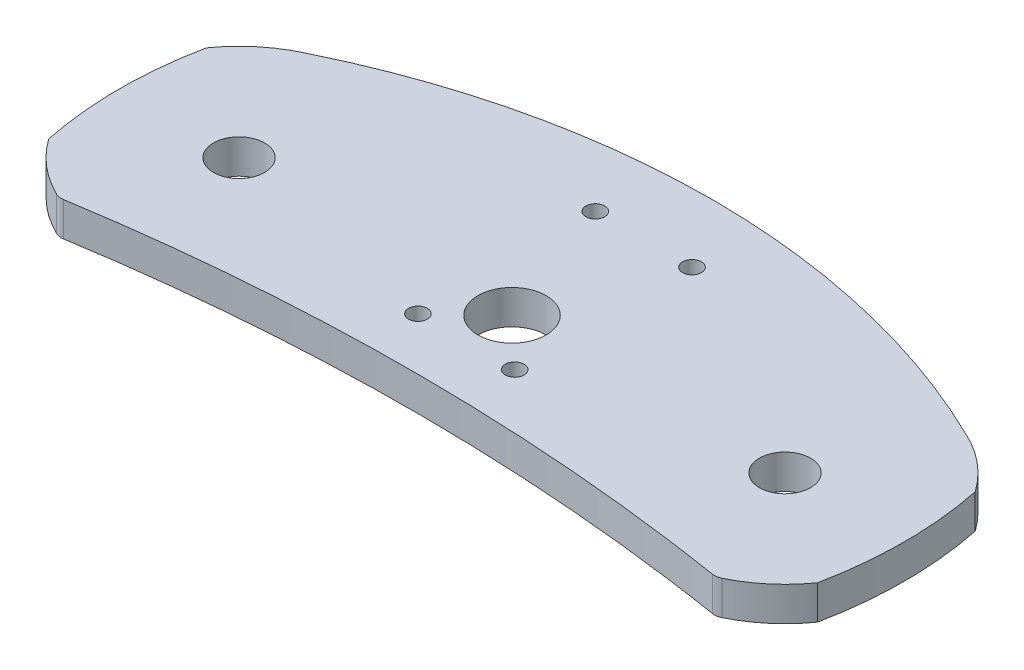
ISO-10303-21;
HEADER;
FILE_DESCRIPTION(('STEP AP214'),'2;1');
FILE_NAME('part.step','',(''),(''),'','','');
FILE_SCHEMA(('AUTOMOTIVE_DESIGN { 1 0 10303 214 1 1 1 1 }'));
ENDSEC;
DATA;
#1=APPLICATION_CONTEXT('core data for automotive mechanical design processes');
#2=APPLICATION_PROTOCOL_DEFINITION('international standard','automotive_design',2000,#1);
#3=PRODUCT_CONTEXT('',#1,'mechanical');
#4=PRODUCT('Part','Part','',(#3));
#5=PRODUCT_RELATED_PRODUCT_CATEGORY('part','',(#4));
#6=PRODUCT_DEFINITION_FORMATION('','',#4);
#7=PRODUCT_DEFINITION_CONTEXT('part definition',#1,'design');
#8=PRODUCT_DEFINITION('design','',#6,#7);
#9=PRODUCT_DEFINITION_SHAPE('','',#8);
#10=(LENGTH_UNIT() NAMED_UNIT(*) SI_UNIT(.MILLI.,.METRE.));
#11=(NAMED_UNIT(*) PLANE_ANGLE_UNIT() SI_UNIT($,.RADIAN.));
#12=(NAMED_UNIT(*) SI_UNIT($,.STERADIAN.) SOLID_ANGLE_UNIT());
#13=UNCERTAINTY_MEASURE_WITH_UNIT(LENGTH_MEASURE(1.E-05),#10,'distance_accuracy_value','');
#14=(GEOMETRIC_REPRESENTATION_CONTEXT(3) GLOBAL_UNCERTAINTY_ASSIGNED_CONTEXT((#13)) GLOBAL_UNIT_ASSIGNED_CONTEXT((#10,
#11,#12)) REPRESENTATION_CONTEXT('',''));
#15=CARTESIAN_POINT('',(0.,0.,0.));
#16=DIRECTION('',(0.,0.,1.));
#17=DIRECTION('',(1.,0.,0.));
#18=AXIS2_PLACEMENT_3D('',#15,#16,#17);
#19=CARTESIAN_POINT('',(0.,6.35,0.));
#20=DIRECTION('',(0.,1.,0.));
#21=DIRECTION('',(0.,0.,1.));
#22=AXIS2_PLACEMENT_3D('',#19,#20,#21);
#23=PLANE('',#22);
#24=CARTESIAN_POINT('',(9.,6.35,8.50000000000001));
#25=DIRECTION('',(0.,1.,0.));
#26=DIRECTION('',(0.,0.,1.));
#27=AXIS2_PLACEMENT_3D('',#24,#25,#26);
#28=CIRCLE('',#27,1.75);
#29=CARTESIAN_POINT('',(9.,6.35,10.25));
#30=VERTEX_POINT('',#29);
#31=EDGE_CURVE('E155',#30,#30,#28,.T.);
#32=ORIENTED_EDGE('',*,*,#31,.F.);
#33=EDGE_LOOP('',(#32));
#34=FACE_BOUND('',#33,.T.);
#35=CARTESIAN_POINT('',(9.,6.35,-24.5));
#36=DIRECTION('',(0.,1.,0.));
#37=DIRECTION('',(0.,0.,1.));
#38=AXIS2_PLACEMENT_3D('',#35,#36,#37);
#39=CIRCLE('',#38,1.75);
#40=CARTESIAN_POINT('',(9.,6.35,-22.75));
#41=VERTEX_POINT('',#40);
#42=EDGE_CURVE('E349',#41,#41,#39,.T.);
#43=ORIENTED_EDGE('',*,*,#42,.F.);
#44=EDGE_LOOP('',(#43));
#45=FACE_BOUND('',#44,.T.);
#46=CARTESIAN_POINT('',(-9.,6.35,-24.5));
#47=DIRECTION('',(0.,1.,0.));
#48=DIRECTION('',(0.,0.,1.));
#49=AXIS2_PLACEMENT_3D('',#46,#47,#48);
#50=CIRCLE('',#49,1.75);
#51=CARTESIAN_POINT('',(-9.,6.35,-22.75));
#52=VERTEX_POINT('',#51);
#53=EDGE_CURVE('E346',#52,#52,#50,.T.);
#54=ORIENTED_EDGE('',*,*,#53,.F.);
#55=EDGE_LOOP('',(#54));
#56=FACE_BOUND('',#55,.T.);
#57=CARTESIAN_POINT('',(-9.,6.35,8.50000000000001));
#58=DIRECTION('',(0.,1.,0.));
#59=DIRECTION('',(0.,0.,1.));
#60=AXIS2_PLACEMENT_3D('',#57,#58,#59);
#61=CIRCLE('',#60,1.75);
#62=CARTESIAN_POINT('',(-9.,6.35,10.25));
#63=VERTEX_POINT('',#62);
#64=EDGE_CURVE('E342',#63,#63,#61,.T.);
#65=ORIENTED_EDGE('',*,*,#64,.F.);
#66=EDGE_LOOP('',(#65));
#67=FACE_BOUND('',#66,.T.);
#68=CARTESIAN_POINT('',(0.,6.35,0.));
#69=DIRECTION('',(0.,1.,0.));
#70=DIRECTION('',(0.,0.,1.));
#71=AXIS2_PLACEMENT_3D('',#68,#69,#70);
#72=CIRCLE('',#71,6.35);
#73=CARTESIAN_POINT('',(0.,6.35,6.35000000000001));
#74=VERTEX_POINT('',#73);
#75=EDGE_CURVE('E187',#74,#74,#72,.T.);
#76=ORIENTED_EDGE('',*,*,#75,.F.);
#77=EDGE_LOOP('',(#76));
#78=FACE_BOUND('',#77,.T.);
#79=CARTESIAN_POINT('',(-50.8,6.35,0.));
#80=DIRECTION('',(0.,1.,0.));
#81=DIRECTION('',(0.,0.,1.));
#82=AXIS2_PLACEMENT_3D('',#79,#80,#81);
#83=CIRCLE('',#82,4.7625);
#84=CARTESIAN_POINT('',(-50.8,6.35,4.7625));
#85=VERTEX_POINT('',#84);
#86=EDGE_CURVE('E178',#85,#85,#83,.T.);
#87=ORIENTED_EDGE('',*,*,#86,.F.);
#88=EDGE_LOOP('',(#87));
#89=FACE_BOUND('',#88,.T.);
#90=CARTESIAN_POINT('',(50.8,6.35,0.));
#91=DIRECTION('',(0.,1.,0.));
#92=DIRECTION('',(0.,0.,1.));
#93=AXIS2_PLACEMENT_3D('',#90,#91,#92);
#94=CIRCLE('',#93,4.7625);
#95=CARTESIAN_POINT('',(50.8,6.35,4.7625));
#96=VERTEX_POINT('',#95);
#97=EDGE_CURVE('E179',#96,#96,#94,.F.);
#98=ORIENTED_EDGE('',*,*,#97,.T.);
#99=EDGE_LOOP('',(#98));
#100=FACE_BOUND('',#99,.T.);
#101=CARTESIAN_POINT('',(-61.1507706135107,6.35,23.1952914986314));
#102=CARTESIAN_POINT('',(2.26673799087616E-13,6.35,13.2848358772638));
#103=CARTESIAN_POINT('',(61.1507706135112,6.35,23.1952914986312));
#104=B_SPLINE_CURVE_WITH_KNOTS('',2,(#101,#102,#103),.UNSPECIFIED.,.F.,.F.,(3,3),(0.,1.),.UNSPECIFIED.);
#105=CARTESIAN_POINT('',(-60.3842002333651,6.35,23.0718352568143));
#106=VERTEX_POINT('',#105);
#107=CARTESIAN_POINT('',(60.3842002333655,6.35,23.0718352568141));
#108=VERTEX_POINT('',#107);
#109=EDGE_CURVE('E257',#106,#108,#104,.T.);
#110=ORIENTED_EDGE('',*,*,#109,.T.);
#111=CARTESIAN_POINT('',(60.7855799828204,6.35,20.5637494734471));
#112=DIRECTION('',(0.,1.,0.));
#113=DIRECTION('',(0.,0.,1.));
#114=AXIS2_PLACEMENT_3D('',#111,#112,#113);
#115=CIRCLE('',#114,2.54);
#116=CARTESIAN_POINT('',(61.8950888698005,6.35,22.8486105260523));
#117=VERTEX_POINT('',#116);
#118=EDGE_CURVE('E237',#108,#117,#115,.T.);
#119=ORIENTED_EDGE('',*,*,#118,.T.);
#120=CARTESIAN_POINT('',(50.8,6.35,0.));
#121=DIRECTION('',(0.,1.,0.));
#122=DIRECTION('',(0.,0.,1.));
#123=AXIS2_PLACEMENT_3D('',#120,#121,#122);
#124=CIRCLE('',#123,25.4);
#125=CARTESIAN_POINT('',(71.53671875,6.35,14.6679410785359));
#126=VERTEX_POINT('',#125);
#127=EDGE_CURVE('E195',#117,#126,#124,.T.);
#128=ORIENTED_EDGE('',*,*,#127,.T.);
#129=CARTESIAN_POINT('',(0.,6.35,0.));
#130=DIRECTION('',(0.,1.,0.));
#131=DIRECTION('',(0.,0.,1.));
#132=AXIS2_PLACEMENT_3D('',#129,#130,#131);
#133=CIRCLE('',#132,73.025);
#134=CARTESIAN_POINT('',(71.53671875,6.35,-14.6679410785359));
#135=VERTEX_POINT('',#134);
#136=EDGE_CURVE('E218',#126,#135,#133,.T.);
#137=ORIENTED_EDGE('',*,*,#136,.T.);
#138=CARTESIAN_POINT('',(50.8,6.35,0.));
#139=DIRECTION('',(0.,1.,0.));
#140=DIRECTION('',(0.,0.,1.));
#141=AXIS2_PLACEMENT_3D('',#138,#139,#140);
#142=CIRCLE('',#141,25.4);
#143=CARTESIAN_POINT('',(61.1507706135103,6.35,-23.1952914986316));
#144=VERTEX_POINT('',#143);
#145=EDGE_CURVE('E148',#135,#144,#142,.T.);
#146=ORIENTED_EDGE('',*,*,#145,.T.);
#147=CARTESIAN_POINT('',(0.,6.35,102.409936312052));
#148=DIRECTION('',(0.,1.,0.));
#149=DIRECTION('',(0.,0.,1.));
#150=AXIS2_PLACEMENT_3D('',#147,#148,#149);
#151=CIRCLE('',#150,139.7);
#152=CARTESIAN_POINT('',(-61.1507706135103,6.35,-23.1952914986316));
#153=VERTEX_POINT('',#152);
#154=EDGE_CURVE('E152',#153,#144,#151,.F.);
#155=ORIENTED_EDGE('',*,*,#154,.F.);
#156=CARTESIAN_POINT('',(-50.8,6.35,0.));
#157=DIRECTION('',(0.,1.,0.));
#158=DIRECTION('',(0.,0.,1.));
#159=AXIS2_PLACEMENT_3D('',#156,#157,#158);
#160=CIRCLE('',#159,25.4);
#161=CARTESIAN_POINT('',(-71.53671875,6.35,-14.6679410785359));
#162=VERTEX_POINT('',#161);
#163=EDGE_CURVE('E128',#153,#162,#160,.T.);
#164=ORIENTED_EDGE('',*,*,#163,.T.);
#165=CARTESIAN_POINT('',(-71.53671875,6.35,14.6679410785359));
#166=VERTEX_POINT('',#165);
#167=EDGE_CURVE('E223',#162,#166,#133,.T.);
#168=ORIENTED_EDGE('',*,*,#167,.T.);
#169=CARTESIAN_POINT('',(-50.8,6.35,0.));
#170=DIRECTION('',(0.,1.,0.));
#171=DIRECTION('',(0.,0.,1.));
#172=AXIS2_PLACEMENT_3D('',#169,#170,#171);
#173=CIRCLE('',#172,25.4);
#174=CARTESIAN_POINT('',(-61.8950888698,6.35,22.8486105260526));
#175=VERTEX_POINT('',#174);
#176=EDGE_CURVE('E199',#166,#175,#173,.T.);
#177=ORIENTED_EDGE('',*,*,#176,.T.);
#178=CARTESIAN_POINT('',(-60.78557998282,6.35,20.5637494734473));
#179=DIRECTION('',(0.,1.,0.));
#180=DIRECTION('',(0.,0.,1.));
#181=AXIS2_PLACEMENT_3D('',#178,#179,#180);
#182=CIRCLE('',#181,2.54);
#183=EDGE_CURVE('E234',#175,#106,#182,.T.);
#184=ORIENTED_EDGE('',*,*,#183,.T.);
#185=EDGE_LOOP('',(#110,#119,#128,#137,#146,#155,#164,#168,#177,#184));
#186=FACE_BOUND('',#185,.T.);
#187=ADVANCED_FACE('F41',(#34,#45,#56,#67,#78,#89,#100,#186),#23,.T.);
#188=CARTESIAN_POINT('',(0.,0.,0.));
#189=DIRECTION('',(0.,1.,0.));
#190=DIRECTION('',(0.,0.,1.));
#191=AXIS2_PLACEMENT_3D('',#188,#189,#190);
#192=PLANE('',#191);
#193=CARTESIAN_POINT('',(0.,0.,0.));
#194=DIRECTION('',(0.,1.,0.));
#195=DIRECTION('',(0.,0.,1.));
#196=AXIS2_PLACEMENT_3D('',#193,#194,#195);
#197=CIRCLE('',#196,6.35);
#198=CARTESIAN_POINT('',(0.,0.,6.35000000000001));
#199=VERTEX_POINT('',#198);
#200=EDGE_CURVE('E183',#199,#199,#197,.T.);
#201=ORIENTED_EDGE('',*,*,#200,.T.);
#202=EDGE_LOOP('',(#201));
#203=FACE_BOUND('',#202,.T.);
#204=CARTESIAN_POINT('',(-50.8,0.,0.));
#205=DIRECTION('',(0.,1.,0.));
#206=DIRECTION('',(0.,0.,1.));
#207=AXIS2_PLACEMENT_3D('',#204,#205,#206);
#208=CIRCLE('',#207,4.7625);
#209=CARTESIAN_POINT('',(-50.8,0.,4.7625));
#210=VERTEX_POINT('',#209);
#211=EDGE_CURVE('E203',#210,#210,#208,.T.);
#212=ORIENTED_EDGE('',*,*,#211,.T.);
#213=EDGE_LOOP('',(#212));
#214=FACE_BOUND('',#213,.T.);
#215=CARTESIAN_POINT('',(50.8,0.,0.));
#216=DIRECTION('',(0.,1.,0.));
#217=DIRECTION('',(0.,0.,1.));
#218=AXIS2_PLACEMENT_3D('',#215,#216,#217);
#219=CIRCLE('',#218,4.7625);
#220=CARTESIAN_POINT('',(50.8,0.,4.7625));
#221=VERTEX_POINT('',#220);
#222=EDGE_CURVE('E174',#221,#221,#219,.F.);
#223=ORIENTED_EDGE('',*,*,#222,.F.);
#224=EDGE_LOOP('',(#223));
#225=FACE_BOUND('',#224,.T.);
#226=CARTESIAN_POINT('',(-9.,0.,8.50000000000001));
#227=DIRECTION('',(0.,-1.,0.));
#228=DIRECTION('',(0.,0.,-1.));
#229=AXIS2_PLACEMENT_3D('',#226,#227,#228);
#230=CIRCLE('',#229,1.75);
#231=CARTESIAN_POINT('',(-9.,0.,6.75000000000001));
#232=VERTEX_POINT('',#231);
#233=EDGE_CURVE('E331',#232,#232,#230,.T.);
#234=ORIENTED_EDGE('',*,*,#233,.F.);
#235=EDGE_LOOP('',(#234));
#236=FACE_BOUND('',#235,.T.);
#237=CARTESIAN_POINT('',(-9.,0.,-24.5));
#238=DIRECTION('',(0.,-1.,0.));
#239=DIRECTION('',(0.,0.,-1.));
#240=AXIS2_PLACEMENT_3D('',#237,#238,#239);
#241=CIRCLE('',#240,1.75);
#242=CARTESIAN_POINT('',(-9.,0.,-26.25));
#243=VERTEX_POINT('',#242);
#244=EDGE_CURVE('E324',#243,#243,#241,.T.);
#245=ORIENTED_EDGE('',*,*,#244,.F.);
#246=EDGE_LOOP('',(#245));
#247=FACE_BOUND('',#246,.T.);
#248=CARTESIAN_POINT('',(9.,0.,-24.5));
#249=DIRECTION('',(0.,-1.,0.));
#250=DIRECTION('',(0.,0.,-1.));
#251=AXIS2_PLACEMENT_3D('',#248,#249,#250);
#252=CIRCLE('',#251,1.75);
#253=CARTESIAN_POINT('',(9.,0.,-26.25));
#254=VERTEX_POINT('',#253);
#255=EDGE_CURVE('E332',#254,#254,#252,.T.);
#256=ORIENTED_EDGE('',*,*,#255,.F.);
#257=EDGE_LOOP('',(#256));
#258=FACE_BOUND('',#257,.T.);
#259=CARTESIAN_POINT('',(9.,0.,8.50000000000001));
#260=DIRECTION('',(0.,-1.,0.));
#261=DIRECTION('',(0.,0.,-1.));
#262=AXIS2_PLACEMENT_3D('',#259,#260,#261);
#263=CIRCLE('',#262,1.75);
#264=CARTESIAN_POINT('',(9.,0.,6.75000000000001));
#265=VERTEX_POINT('',#264);
#266=EDGE_CURVE('E256',#265,#265,#263,.T.);
#267=ORIENTED_EDGE('',*,*,#266,.F.);
#268=EDGE_LOOP('',(#267));
#269=FACE_BOUND('',#268,.T.);
#270=CARTESIAN_POINT('',(50.8,0.,0.));
#271=DIRECTION('',(0.,1.,0.));
#272=DIRECTION('',(0.,0.,1.));
#273=AXIS2_PLACEMENT_3D('',#270,#271,#272);
#274=CIRCLE('',#273,25.4);
#275=CARTESIAN_POINT('',(61.8950888698005,0.,22.8486105260523));
#276=VERTEX_POINT('',#275);
#277=CARTESIAN_POINT('',(71.53671875,0.,14.6679410785359));
#278=VERTEX_POINT('',#277);
#279=EDGE_CURVE('E194',#276,#278,#274,.T.);
#280=ORIENTED_EDGE('',*,*,#279,.F.);
#281=CARTESIAN_POINT('',(60.7855799828204,0.,20.5637494734471));
#282=DIRECTION('',(0.,1.,0.));
#283=DIRECTION('',(0.,0.,1.));
#284=AXIS2_PLACEMENT_3D('',#281,#282,#283);
#285=CIRCLE('',#284,2.54);
#286=CARTESIAN_POINT('',(60.3842002333655,0.,23.0718352568141));
#287=VERTEX_POINT('',#286);
#288=EDGE_CURVE('E50',#276,#287,#285,.F.);
#289=ORIENTED_EDGE('',*,*,#288,.T.);
#290=CARTESIAN_POINT('',(-61.1507706135107,0.,23.1952914986314));
#291=CARTESIAN_POINT('',(2.26673799087616E-13,0.,13.2848358772638));
#292=CARTESIAN_POINT('',(61.1507706135112,0.,23.1952914986312));
#293=B_SPLINE_CURVE_WITH_KNOTS('',2,(#290,#291,#292),.UNSPECIFIED.,.F.,.F.,(3,3),(0.,1.),.UNSPECIFIED.);
#294=CARTESIAN_POINT('',(-60.3842002333651,0.,23.0718352568143));
#295=VERTEX_POINT('',#294);
#296=EDGE_CURVE('E246',#295,#287,#293,.T.);
#297=ORIENTED_EDGE('',*,*,#296,.F.);
#298=CARTESIAN_POINT('',(-60.78557998282,0.,20.5637494734473));
#299=DIRECTION('',(0.,1.,0.));
#300=DIRECTION('',(0.,0.,1.));
#301=AXIS2_PLACEMENT_3D('',#298,#299,#300);
#302=CIRCLE('',#301,2.54);
#303=CARTESIAN_POINT('',(-61.8950888698,0.,22.8486105260526));
#304=VERTEX_POINT('',#303);
#305=EDGE_CURVE('E57',#295,#304,#302,.F.);
#306=ORIENTED_EDGE('',*,*,#305,.T.);
#307=CARTESIAN_POINT('',(-50.8,0.,0.));
#308=DIRECTION('',(0.,1.,0.));
#309=DIRECTION('',(0.,0.,1.));
#310=AXIS2_PLACEMENT_3D('',#307,#308,#309);
#311=CIRCLE('',#310,25.4);
#312=CARTESIAN_POINT('',(-71.53671875,0.,14.6679410785359));
#313=VERTEX_POINT('',#312);
#314=EDGE_CURVE('E191',#313,#304,#311,.T.);
#315=ORIENTED_EDGE('',*,*,#314,.F.);
#316=CARTESIAN_POINT('',(0.,0.,0.));
#317=DIRECTION('',(0.,1.,0.));
#318=DIRECTION('',(0.,0.,1.));
#319=AXIS2_PLACEMENT_3D('',#316,#317,#318);
#320=CIRCLE('',#319,73.025);
#321=CARTESIAN_POINT('',(-71.53671875,0.,-14.6679410785359));
#322=VERTEX_POINT('',#321);
#323=EDGE_CURVE('E146',#322,#313,#320,.T.);
#324=ORIENTED_EDGE('',*,*,#323,.F.);
#325=CARTESIAN_POINT('',(-50.8,0.,0.));
#326=DIRECTION('',(0.,1.,0.));
#327=DIRECTION('',(0.,0.,1.));
#328=AXIS2_PLACEMENT_3D('',#325,#326,#327);
#329=CIRCLE('',#328,25.4);
#330=CARTESIAN_POINT('',(-61.1507706135103,0.,-23.1952914986316));
#331=VERTEX_POINT('',#330);
#332=EDGE_CURVE('E125',#331,#322,#329,.T.);
#333=ORIENTED_EDGE('',*,*,#332,.F.);
#334=CARTESIAN_POINT('',(0.,0.,102.409936312052));
#335=DIRECTION('',(0.,1.,0.));
#336=DIRECTION('',(0.,0.,1.));
#337=AXIS2_PLACEMENT_3D('',#334,#335,#336);
#338=CIRCLE('',#337,139.7);
#339=CARTESIAN_POINT('',(61.1507706135103,0.,-23.1952914986316));
#340=VERTEX_POINT('',#339);
#341=EDGE_CURVE('E137',#331,#340,#338,.F.);
#342=ORIENTED_EDGE('',*,*,#341,.T.);
#343=CARTESIAN_POINT('',(50.8,0.,0.));
#344=DIRECTION('',(0.,1.,0.));
#345=DIRECTION('',(0.,0.,1.));
#346=AXIS2_PLACEMENT_3D('',#343,#344,#345);
#347=CIRCLE('',#346,25.4);
#348=CARTESIAN_POINT('',(71.53671875,0.,-14.6679410785359));
#349=VERTEX_POINT('',#348);
#350=EDGE_CURVE('E134',#349,#340,#347,.T.);
#351=ORIENTED_EDGE('',*,*,#350,.F.);
#352=EDGE_CURVE('E224',#278,#349,#320,.T.);
#353=ORIENTED_EDGE('',*,*,#352,.F.);
#354=EDGE_LOOP('',(#280,#289,#297,#306,#315,#324,#333,#342,#351,#353));
#355=FACE_BOUND('',#354,.T.);
#356=ADVANCED_FACE('F144',(#203,#214,#225,#236,#247,#258,#269,#355),#192,.F.);
#357=CARTESIAN_POINT('',(0.,6.35,0.));
#358=DIRECTION('',(0.,-1.,0.));
#359=DIRECTION('',(0.,0.,-1.));
#360=AXIS2_PLACEMENT_3D('',#357,#358,#359);
#361=CYLINDRICAL_SURFACE('',#360,73.025);
#362=DIRECTION('',(0.,1.,0.));
#363=VECTOR('',#362,1.);
#364=CARTESIAN_POINT('',(-71.53671875,0.,-14.6679410785359));
#365=LINE('',#364,#363);
#366=EDGE_CURVE('E165',#322,#162,#365,.T.);
#367=ORIENTED_EDGE('',*,*,#366,.F.);
#368=ORIENTED_EDGE('',*,*,#323,.T.);
#369=DIRECTION('',(0.,1.,0.));
#370=VECTOR('',#369,1.);
#371=CARTESIAN_POINT('',(-71.53671875,0.,14.6679410785359));
#372=LINE('',#371,#370);
#373=EDGE_CURVE('E198',#313,#166,#372,.T.);
#374=ORIENTED_EDGE('',*,*,#373,.T.);
#375=ORIENTED_EDGE('',*,*,#167,.F.);
#376=EDGE_LOOP('',(#367,#368,#374,#375));
#377=FACE_BOUND('',#376,.T.);
#378=ADVANCED_FACE('F285',(#377),#361,.T.);
#379=DIRECTION('',(0.,1.,0.));
#380=VECTOR('',#379,1.);
#381=CARTESIAN_POINT('',(71.53671875,0.,-14.6679410785359));
#382=LINE('',#381,#380);
#383=EDGE_CURVE('E168',#349,#135,#382,.T.);
#384=ORIENTED_EDGE('',*,*,#383,.T.);
#385=ORIENTED_EDGE('',*,*,#136,.F.);
#386=DIRECTION('',(0.,1.,0.));
#387=VECTOR('',#386,1.);
#388=CARTESIAN_POINT('',(71.53671875,0.,14.6679410785359));
#389=LINE('',#388,#387);
#390=EDGE_CURVE('E162',#278,#126,#389,.T.);
#391=ORIENTED_EDGE('',*,*,#390,.F.);
#392=ORIENTED_EDGE('',*,*,#352,.T.);
#393=EDGE_LOOP('',(#384,#385,#391,#392));
#394=FACE_BOUND('',#393,.T.);
#395=ADVANCED_FACE('F265',(#394),#361,.T.);
#396=CARTESIAN_POINT('',(50.8,0.,0.));
#397=DIRECTION('',(0.,1.,0.));
#398=DIRECTION('',(0.,0.,1.));
#399=AXIS2_PLACEMENT_3D('',#396,#397,#398);
#400=CYLINDRICAL_SURFACE('',#399,25.4);
#401=ORIENTED_EDGE('',*,*,#127,.F.);
#402=DIRECTION('',(0.,1.,0.));
#403=VECTOR('',#402,1.);
#404=CARTESIAN_POINT('',(61.8950888698005,0.,22.8486105260523));
#405=LINE('',#404,#403);
#406=EDGE_CURVE('E65',#117,#276,#405,.F.);
#407=ORIENTED_EDGE('',*,*,#406,.T.);
#408=ORIENTED_EDGE('',*,*,#279,.T.);
#409=ORIENTED_EDGE('',*,*,#390,.T.);
#410=EDGE_LOOP('',(#401,#407,#408,#409));
#411=FACE_BOUND('',#410,.T.);
#412=ADVANCED_FACE('F261',(#411),#400,.T.);
#413=CARTESIAN_POINT('',(-50.8,0.,0.));
#414=DIRECTION('',(0.,1.,0.));
#415=DIRECTION('',(0.,0.,1.));
#416=AXIS2_PLACEMENT_3D('',#413,#414,#415);
#417=CYLINDRICAL_SURFACE('',#416,25.4);
#418=ORIENTED_EDGE('',*,*,#314,.T.);
#419=DIRECTION('',(0.,1.,0.));
#420=VECTOR('',#419,1.);
#421=CARTESIAN_POINT('',(-61.8950888698,0.,22.8486105260526));
#422=LINE('',#421,#420);
#423=EDGE_CURVE('E11',#304,#175,#422,.T.);
#424=ORIENTED_EDGE('',*,*,#423,.T.);
#425=ORIENTED_EDGE('',*,*,#176,.F.);
#426=ORIENTED_EDGE('',*,*,#373,.F.);
#427=EDGE_LOOP('',(#418,#424,#425,#426));
#428=FACE_BOUND('',#427,.T.);
#429=ADVANCED_FACE('F381',(#428),#417,.T.);
#430=CARTESIAN_POINT('',(-50.8,0.,0.));
#431=DIRECTION('',(0.,1.,0.));
#432=DIRECTION('',(0.,0.,1.));
#433=AXIS2_PLACEMENT_3D('',#430,#431,#432);
#434=CYLINDRICAL_SURFACE('',#433,4.7625);
#435=ORIENTED_EDGE('',*,*,#211,.F.);
#436=EDGE_LOOP('',(#435));
#437=FACE_BOUND('',#436,.T.);
#438=ORIENTED_EDGE('',*,*,#86,.T.);
#439=EDGE_LOOP('',(#438));
#440=FACE_BOUND('',#439,.T.);
#441=ADVANCED_FACE('F291',(#437,#440),#434,.F.);
#442=CARTESIAN_POINT('',(50.8,0.,0.));
#443=DIRECTION('',(0.,1.,0.));
#444=DIRECTION('',(0.,0.,1.));
#445=AXIS2_PLACEMENT_3D('',#442,#443,#444);
#446=CYLINDRICAL_SURFACE('',#445,4.7625);
#447=ORIENTED_EDGE('',*,*,#222,.T.);
#448=EDGE_LOOP('',(#447));
#449=FACE_BOUND('',#448,.T.);
#450=ORIENTED_EDGE('',*,*,#97,.F.);
#451=EDGE_LOOP('',(#450));
#452=FACE_BOUND('',#451,.T.);
#453=ADVANCED_FACE('F371',(#449,#452),#446,.F.);
#454=CARTESIAN_POINT('',(0.,0.,0.));
#455=DIRECTION('',(0.,1.,0.));
#456=DIRECTION('',(0.,0.,1.));
#457=AXIS2_PLACEMENT_3D('',#454,#455,#456);
#458=CYLINDRICAL_SURFACE('',#457,6.35);
#459=ORIENTED_EDGE('',*,*,#200,.F.);
#460=EDGE_LOOP('',(#459));
#461=FACE_BOUND('',#460,.T.);
#462=ORIENTED_EDGE('',*,*,#75,.T.);
#463=EDGE_LOOP('',(#462));
#464=FACE_BOUND('',#463,.T.);
#465=ADVANCED_FACE('F276',(#461,#464),#458,.F.);
#466=CARTESIAN_POINT('',(-50.8,0.,0.));
#467=DIRECTION('',(0.,1.,0.));
#468=DIRECTION('',(0.,0.,1.));
#469=AXIS2_PLACEMENT_3D('',#466,#467,#468);
#470=CYLINDRICAL_SURFACE('',#469,25.4);
#471=ORIENTED_EDGE('',*,*,#163,.F.);
#472=DIRECTION('',(0.,1.,0.));
#473=VECTOR('',#472,1.);
#474=CARTESIAN_POINT('',(-61.1507706135103,0.,-23.1952914986316));
#475=LINE('',#474,#473);
#476=EDGE_CURVE('E121',#331,#153,#475,.T.);
#477=ORIENTED_EDGE('',*,*,#476,.F.);
#478=ORIENTED_EDGE('',*,*,#332,.T.);
#479=ORIENTED_EDGE('',*,*,#366,.T.);
#480=EDGE_LOOP('',(#471,#477,#478,#479));
#481=FACE_BOUND('',#480,.T.);
#482=ADVANCED_FACE('F123',(#481),#470,.T.);
#483=CARTESIAN_POINT('',(50.8,0.,0.));
#484=DIRECTION('',(0.,1.,0.));
#485=DIRECTION('',(0.,0.,1.));
#486=AXIS2_PLACEMENT_3D('',#483,#484,#485);
#487=CYLINDRICAL_SURFACE('',#486,25.4);
#488=ORIENTED_EDGE('',*,*,#145,.F.);
#489=ORIENTED_EDGE('',*,*,#383,.F.);
#490=ORIENTED_EDGE('',*,*,#350,.T.);
#491=DIRECTION('',(0.,1.,0.));
#492=VECTOR('',#491,1.);
#493=CARTESIAN_POINT('',(61.1507706135103,0.,-23.1952914986316));
#494=LINE('',#493,#492);
#495=EDGE_CURVE('E133',#340,#144,#494,.T.);
#496=ORIENTED_EDGE('',*,*,#495,.T.);
#497=EDGE_LOOP('',(#488,#489,#490,#496));
#498=FACE_BOUND('',#497,.T.);
#499=ADVANCED_FACE('F267',(#498),#487,.T.);
#500=CARTESIAN_POINT('',(0.,0.,102.409936312052));
#501=DIRECTION('',(0.,1.,0.));
#502=DIRECTION('',(0.,0.,1.));
#503=AXIS2_PLACEMENT_3D('',#500,#501,#502);
#504=CYLINDRICAL_SURFACE('',#503,139.7);
#505=ORIENTED_EDGE('',*,*,#154,.T.);
#506=ORIENTED_EDGE('',*,*,#495,.F.);
#507=ORIENTED_EDGE('',*,*,#341,.F.);
#508=ORIENTED_EDGE('',*,*,#476,.T.);
#509=EDGE_LOOP('',(#505,#506,#507,#508));
#510=FACE_BOUND('',#509,.T.);
#511=ADVANCED_FACE('F138',(#510),#504,.T.);
#512=CARTESIAN_POINT('',(-9.,10.,8.50000000000001));
#513=DIRECTION('',(0.,-1.,0.));
#514=DIRECTION('',(0.,0.,-1.));
#515=AXIS2_PLACEMENT_3D('',#512,#513,#514);
#516=CYLINDRICAL_SURFACE('',#515,1.75);
#517=ORIENTED_EDGE('',*,*,#64,.T.);
#518=EDGE_LOOP('',(#517));
#519=FACE_BOUND('',#518,.T.);
#520=ORIENTED_EDGE('',*,*,#233,.T.);
#521=EDGE_LOOP('',(#520));
#522=FACE_BOUND('',#521,.T.);
#523=ADVANCED_FACE('F274',(#519,#522),#516,.F.);
#524=CARTESIAN_POINT('',(-9.,10.,-24.5));
#525=DIRECTION('',(0.,-1.,0.));
#526=DIRECTION('',(0.,0.,-1.));
#527=AXIS2_PLACEMENT_3D('',#524,#525,#526);
#528=CYLINDRICAL_SURFACE('',#527,1.75);
#529=ORIENTED_EDGE('',*,*,#53,.T.);
#530=EDGE_LOOP('',(#529));
#531=FACE_BOUND('',#530,.T.);
#532=ORIENTED_EDGE('',*,*,#244,.T.);
#533=EDGE_LOOP('',(#532));
#534=FACE_BOUND('',#533,.T.);
#535=ADVANCED_FACE('F311',(#531,#534),#528,.F.);
#536=CARTESIAN_POINT('',(9.,10.,-24.5));
#537=DIRECTION('',(0.,-1.,0.));
#538=DIRECTION('',(0.,0.,-1.));
#539=AXIS2_PLACEMENT_3D('',#536,#537,#538);
#540=CYLINDRICAL_SURFACE('',#539,1.75);
#541=ORIENTED_EDGE('',*,*,#42,.T.);
#542=EDGE_LOOP('',(#541));
#543=FACE_BOUND('',#542,.T.);
#544=ORIENTED_EDGE('',*,*,#255,.T.);
#545=EDGE_LOOP('',(#544));
#546=FACE_BOUND('',#545,.T.);
#547=ADVANCED_FACE('F307',(#543,#546),#540,.F.);
#548=CARTESIAN_POINT('',(9.,10.,8.50000000000001));
#549=DIRECTION('',(0.,-1.,0.));
#550=DIRECTION('',(0.,0.,-1.));
#551=AXIS2_PLACEMENT_3D('',#548,#549,#550);
#552=CYLINDRICAL_SURFACE('',#551,1.75);
#553=ORIENTED_EDGE('',*,*,#31,.T.);
#554=EDGE_LOOP('',(#553));
#555=FACE_BOUND('',#554,.T.);
#556=ORIENTED_EDGE('',*,*,#266,.T.);
#557=EDGE_LOOP('',(#556));
#558=FACE_BOUND('',#557,.T.);
#559=ADVANCED_FACE('F302',(#555,#558),#552,.F.);
#560=DIRECTION('',(0.,1.,0.));
#561=VECTOR('',#560,1.);
#562=SURFACE_OF_LINEAR_EXTRUSION('',#293,#561);
#563=ORIENTED_EDGE('',*,*,#296,.T.);
#564=DIRECTION('',(0.,1.,0.));
#565=VECTOR('',#564,1.);
#566=CARTESIAN_POINT('',(60.3842002333655,0.,23.0718352568141));
#567=LINE('',#566,#565);
#568=EDGE_CURVE('E230',#287,#108,#567,.T.);
#569=ORIENTED_EDGE('',*,*,#568,.T.);
#570=ORIENTED_EDGE('',*,*,#109,.F.);
#571=DIRECTION('',(0.,1.,0.));
#572=VECTOR('',#571,1.);
#573=CARTESIAN_POINT('',(-60.3842002333651,6.35,23.0718352568143));
#574=LINE('',#573,#572);
#575=EDGE_CURVE('E222',#106,#295,#574,.F.);
#576=ORIENTED_EDGE('',*,*,#575,.T.);
#577=EDGE_LOOP('',(#563,#569,#570,#576));
#578=FACE_BOUND('',#577,.T.);
#579=ADVANCED_FACE('F251',(#578),#562,.T.);
#580=CARTESIAN_POINT('',(60.7855799828204,3.175,20.5637494734471));
#581=DIRECTION('',(0.,1.,0.));
#582=DIRECTION('',(0.,0.,1.));
#583=AXIS2_PLACEMENT_3D('',#580,#581,#582);
#584=CYLINDRICAL_SURFACE('',#583,2.54);
#585=ORIENTED_EDGE('',*,*,#288,.F.);
#586=ORIENTED_EDGE('',*,*,#406,.F.);
#587=ORIENTED_EDGE('',*,*,#118,.F.);
#588=ORIENTED_EDGE('',*,*,#568,.F.);
#589=EDGE_LOOP('',(#585,#586,#587,#588));
#590=FACE_BOUND('',#589,.T.);
#591=ADVANCED_FACE('F259',(#590),#584,.T.);
#592=CARTESIAN_POINT('',(-60.78557998282,3.175,20.5637494734473));
#593=DIRECTION('',(0.,1.,0.));
#594=DIRECTION('',(0.,0.,1.));
#595=AXIS2_PLACEMENT_3D('',#592,#593,#594);
#596=CYLINDRICAL_SURFACE('',#595,2.54);
#597=ORIENTED_EDGE('',*,*,#305,.F.);
#598=ORIENTED_EDGE('',*,*,#575,.F.);
#599=ORIENTED_EDGE('',*,*,#183,.F.);
#600=ORIENTED_EDGE('',*,*,#423,.F.);
#601=EDGE_LOOP('',(#597,#598,#599,#600));
#602=FACE_BOUND('',#601,.T.);
#603=ADVANCED_FACE('F43',(#602),#596,.T.);
#604=CLOSED_SHELL('',(#187,#356,#378,#395,#412,#429,#441,#453,#465,#482,#499,#511,#523,#535,
#547,#559,#579,#591,#603));
#605=MANIFOLD_SOLID_BREP('B2',#604);
#606=ADVANCED_BREP_SHAPE_REPRESENTATION('',(#18,#605),#14);
#607=SHAPE_DEFINITION_REPRESENTATION(#9,#606);
ENDSEC;
END-ISO-10303-21;
